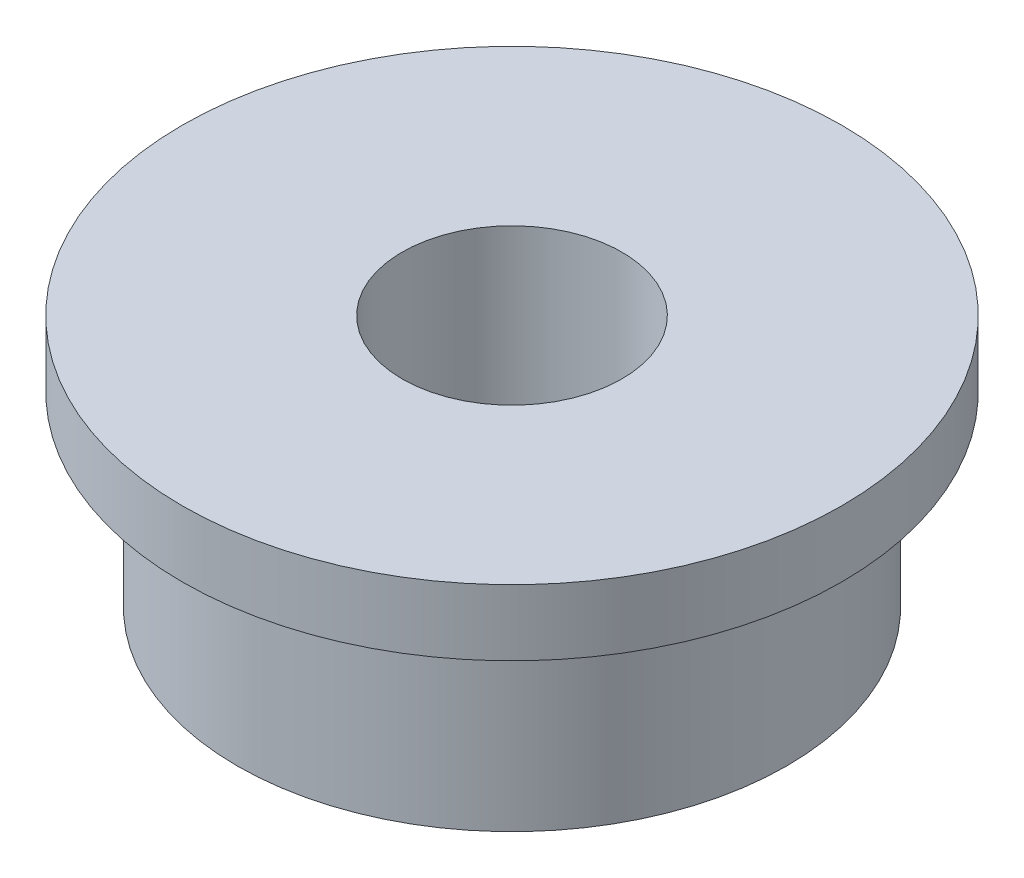
ISO-10303-21;
HEADER;
FILE_DESCRIPTION(('STEP AP214'),'2;1');
FILE_NAME('part.step','',(''),(''),'','','');
FILE_SCHEMA(('AUTOMOTIVE_DESIGN { 1 0 10303 214 1 1 1 1 }'));
ENDSEC;
DATA;
#1=APPLICATION_CONTEXT('core data for automotive mechanical design processes');
#2=APPLICATION_PROTOCOL_DEFINITION('international standard','automotive_design',2000,#1);
#3=PRODUCT_CONTEXT('',#1,'mechanical');
#4=PRODUCT('Part','Part','',(#3));
#5=PRODUCT_RELATED_PRODUCT_CATEGORY('part','',(#4));
#6=PRODUCT_DEFINITION_FORMATION('','',#4);
#7=PRODUCT_DEFINITION_CONTEXT('part definition',#1,'design');
#8=PRODUCT_DEFINITION('design','',#6,#7);
#9=PRODUCT_DEFINITION_SHAPE('','',#8);
#10=(LENGTH_UNIT() NAMED_UNIT(*) SI_UNIT(.MILLI.,.METRE.));
#11=(NAMED_UNIT(*) PLANE_ANGLE_UNIT() SI_UNIT($,.RADIAN.));
#12=(NAMED_UNIT(*) SI_UNIT($,.STERADIAN.) SOLID_ANGLE_UNIT());
#13=UNCERTAINTY_MEASURE_WITH_UNIT(LENGTH_MEASURE(1.E-05),#10,'distance_accuracy_value','');
#14=(GEOMETRIC_REPRESENTATION_CONTEXT(3) GLOBAL_UNCERTAINTY_ASSIGNED_CONTEXT((#13)) GLOBAL_UNIT_ASSIGNED_CONTEXT((#10,
#11,#12)) REPRESENTATION_CONTEXT('',''));
#15=CARTESIAN_POINT('',(0.,0.,0.));
#16=DIRECTION('',(0.,0.,1.));
#17=DIRECTION('',(1.,0.,0.));
#18=AXIS2_PLACEMENT_3D('',#15,#16,#17);
#19=CARTESIAN_POINT('',(0.,2.3,0.));
#20=DIRECTION('',(0.,-1.,0.));
#21=DIRECTION('',(0.,0.,-1.));
#22=AXIS2_PLACEMENT_3D('',#19,#20,#21);
#23=CYLINDRICAL_SURFACE('',#22,2.5);
#24=CARTESIAN_POINT('',(0.,0.,0.));
#25=DIRECTION('',(0.,1.,0.));
#26=DIRECTION('',(0.,0.,1.));
#27=AXIS2_PLACEMENT_3D('',#24,#25,#26);
#28=CIRCLE('',#27,2.5);
#29=CARTESIAN_POINT('',(0.,0.,2.5));
#30=VERTEX_POINT('',#29);
#31=EDGE_CURVE('E40',#30,#30,#28,.T.);
#32=ORIENTED_EDGE('',*,*,#31,.T.);
#33=EDGE_LOOP('',(#32));
#34=FACE_BOUND('',#33,.T.);
#35=CARTESIAN_POINT('',(0.,1.7,0.));
#36=DIRECTION('',(0.,1.,0.));
#37=DIRECTION('',(0.,0.,1.));
#38=AXIS2_PLACEMENT_3D('',#35,#36,#37);
#39=CIRCLE('',#38,2.5);
#40=CARTESIAN_POINT('',(0.,1.7,2.5));
#41=VERTEX_POINT('',#40);
#42=EDGE_CURVE('E10',#41,#41,#39,.T.);
#43=ORIENTED_EDGE('',*,*,#42,.F.);
#44=EDGE_LOOP('',(#43));
#45=FACE_BOUND('',#44,.T.);
#46=ADVANCED_FACE('F37',(#34,#45),#23,.T.);
#47=CARTESIAN_POINT('',(0.,2.3,0.));
#48=DIRECTION('',(0.,1.,0.));
#49=DIRECTION('',(0.,0.,1.));
#50=AXIS2_PLACEMENT_3D('',#47,#48,#49);
#51=PLANE('',#50);
#52=CARTESIAN_POINT('',(0.,2.3,0.));
#53=DIRECTION('',(0.,1.,0.));
#54=DIRECTION('',(0.,0.,1.));
#55=AXIS2_PLACEMENT_3D('',#52,#53,#54);
#56=CIRCLE('',#55,1.);
#57=CARTESIAN_POINT('',(0.,2.3,1.));
#58=VERTEX_POINT('',#57);
#59=EDGE_CURVE('E48',#58,#58,#56,.T.);
#60=ORIENTED_EDGE('',*,*,#59,.F.);
#61=EDGE_LOOP('',(#60));
#62=FACE_BOUND('',#61,.T.);
#63=CARTESIAN_POINT('',(0.,2.3,0.));
#64=DIRECTION('',(0.,1.,0.));
#65=DIRECTION('',(0.,0.,1.));
#66=AXIS2_PLACEMENT_3D('',#63,#64,#65);
#67=CIRCLE('',#66,3.);
#68=CARTESIAN_POINT('',(0.,2.3,3.));
#69=VERTEX_POINT('',#68);
#70=EDGE_CURVE('E51',#69,#69,#67,.T.);
#71=ORIENTED_EDGE('',*,*,#70,.T.);
#72=EDGE_LOOP('',(#71));
#73=FACE_BOUND('',#72,.T.);
#74=ADVANCED_FACE('F65',(#62,#73),#51,.T.);
#75=CARTESIAN_POINT('',(0.,0.,0.));
#76=DIRECTION('',(0.,1.,0.));
#77=DIRECTION('',(0.,0.,1.));
#78=AXIS2_PLACEMENT_3D('',#75,#76,#77);
#79=PLANE('',#78);
#80=ORIENTED_EDGE('',*,*,#31,.F.);
#81=EDGE_LOOP('',(#80));
#82=FACE_BOUND('',#81,.T.);
#83=CARTESIAN_POINT('',(0.,0.,0.));
#84=DIRECTION('',(0.,1.,0.));
#85=DIRECTION('',(0.,0.,1.));
#86=AXIS2_PLACEMENT_3D('',#83,#84,#85);
#87=CIRCLE('',#86,1.);
#88=CARTESIAN_POINT('',(0.,0.,1.));
#89=VERTEX_POINT('',#88);
#90=EDGE_CURVE('E54',#89,#89,#87,.T.);
#91=ORIENTED_EDGE('',*,*,#90,.T.);
#92=EDGE_LOOP('',(#91));
#93=FACE_BOUND('',#92,.T.);
#94=ADVANCED_FACE('F84',(#82,#93),#79,.F.);
#95=CARTESIAN_POINT('',(0.,2.3,0.));
#96=DIRECTION('',(0.,-1.,0.));
#97=DIRECTION('',(0.,0.,-1.));
#98=AXIS2_PLACEMENT_3D('',#95,#96,#97);
#99=CYLINDRICAL_SURFACE('',#98,1.);
#100=ORIENTED_EDGE('',*,*,#59,.T.);
#101=EDGE_LOOP('',(#100));
#102=FACE_BOUND('',#101,.T.);
#103=ORIENTED_EDGE('',*,*,#90,.F.);
#104=EDGE_LOOP('',(#103));
#105=FACE_BOUND('',#104,.T.);
#106=ADVANCED_FACE('F74',(#102,#105),#99,.F.);
#107=CARTESIAN_POINT('',(0.,1.7,0.));
#108=DIRECTION('',(0.,1.,0.));
#109=DIRECTION('',(0.,0.,1.));
#110=AXIS2_PLACEMENT_3D('',#107,#108,#109);
#111=PLANE('',#110);
#112=CARTESIAN_POINT('',(0.,1.7,0.));
#113=DIRECTION('',(0.,1.,0.));
#114=DIRECTION('',(0.,0.,1.));
#115=AXIS2_PLACEMENT_3D('',#112,#113,#114);
#116=CIRCLE('',#115,3.);
#117=CARTESIAN_POINT('',(0.,1.7,3.));
#118=VERTEX_POINT('',#117);
#119=EDGE_CURVE('E56',#118,#118,#116,.T.);
#120=ORIENTED_EDGE('',*,*,#119,.F.);
#121=EDGE_LOOP('',(#120));
#122=FACE_BOUND('',#121,.T.);
#123=ORIENTED_EDGE('',*,*,#42,.T.);
#124=EDGE_LOOP('',(#123));
#125=FACE_BOUND('',#124,.T.);
#126=ADVANCED_FACE('F69',(#122,#125),#111,.F.);
#127=CARTESIAN_POINT('',(0.,1.7,0.));
#128=DIRECTION('',(0.,1.,0.));
#129=DIRECTION('',(0.,0.,1.));
#130=AXIS2_PLACEMENT_3D('',#127,#128,#129);
#131=CYLINDRICAL_SURFACE('',#130,3.);
#132=ORIENTED_EDGE('',*,*,#119,.T.);
#133=EDGE_LOOP('',(#132));
#134=FACE_BOUND('',#133,.T.);
#135=ORIENTED_EDGE('',*,*,#70,.F.);
#136=EDGE_LOOP('',(#135));
#137=FACE_BOUND('',#136,.T.);
#138=ADVANCED_FACE('F67',(#134,#137),#131,.T.);
#139=CLOSED_SHELL('',(#46,#74,#94,#106,#126,#138));
#140=MANIFOLD_SOLID_BREP('B2',#139);
#141=ADVANCED_BREP_SHAPE_REPRESENTATION('',(#18,#140),#14);
#142=SHAPE_DEFINITION_REPRESENTATION(#9,#141);
ENDSEC;
END-ISO-10303-21;
